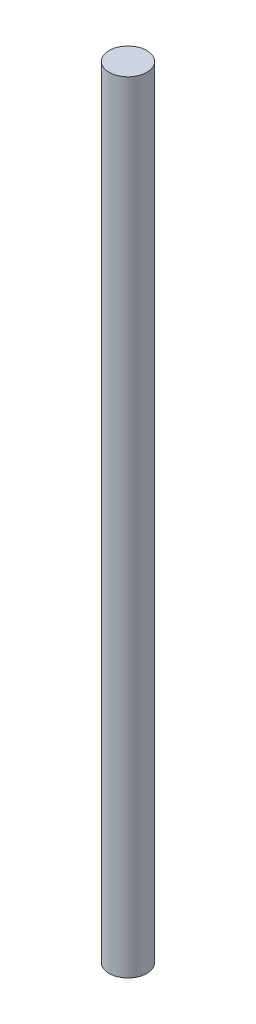
ISO-10303-21;
HEADER;
FILE_DESCRIPTION(('STEP AP214'),'2;1');
FILE_NAME('part.step','',(''),(''),'','','');
FILE_SCHEMA(('AUTOMOTIVE_DESIGN { 1 0 10303 214 1 1 1 1 }'));
ENDSEC;
DATA;
#1=APPLICATION_CONTEXT('core data for automotive mechanical design processes');
#2=APPLICATION_PROTOCOL_DEFINITION('international standard','automotive_design',2000,#1);
#3=PRODUCT_CONTEXT('',#1,'mechanical');
#4=PRODUCT('Part','Part','',(#3));
#5=PRODUCT_RELATED_PRODUCT_CATEGORY('part','',(#4));
#6=PRODUCT_DEFINITION_FORMATION('','',#4);
#7=PRODUCT_DEFINITION_CONTEXT('part definition',#1,'design');
#8=PRODUCT_DEFINITION('design','',#6,#7);
#9=PRODUCT_DEFINITION_SHAPE('','',#8);
#10=(LENGTH_UNIT() NAMED_UNIT(*) SI_UNIT(.MILLI.,.METRE.));
#11=(NAMED_UNIT(*) PLANE_ANGLE_UNIT() SI_UNIT($,.RADIAN.));
#12=(NAMED_UNIT(*) SI_UNIT($,.STERADIAN.) SOLID_ANGLE_UNIT());
#13=UNCERTAINTY_MEASURE_WITH_UNIT(LENGTH_MEASURE(1.E-05),#10,'distance_accuracy_value','');
#14=(GEOMETRIC_REPRESENTATION_CONTEXT(3) GLOBAL_UNCERTAINTY_ASSIGNED_CONTEXT((#13)) GLOBAL_UNIT_ASSIGNED_CONTEXT((#10,
#11,#12)) REPRESENTATION_CONTEXT('',''));
#15=CARTESIAN_POINT('',(0.,0.,0.));
#16=DIRECTION('',(0.,0.,1.));
#17=DIRECTION('',(1.,0.,0.));
#18=AXIS2_PLACEMENT_3D('',#15,#16,#17);
#19=CARTESIAN_POINT('',(0.,120.,0.));
#20=DIRECTION('',(0.,-1.,0.));
#21=DIRECTION('',(0.,0.,-1.));
#22=AXIS2_PLACEMENT_3D('',#19,#20,#21);
#23=CYLINDRICAL_SURFACE('',#22,2.9);
#24=CARTESIAN_POINT('',(0.,120.,0.));
#25=DIRECTION('',(0.,1.,0.));
#26=DIRECTION('',(0.,0.,1.));
#27=AXIS2_PLACEMENT_3D('',#24,#25,#26);
#28=CIRCLE('',#27,2.9);
#29=CARTESIAN_POINT('',(0.,120.,2.9));
#30=VERTEX_POINT('',#29);
#31=EDGE_CURVE('E10',#30,#30,#28,.T.);
#32=ORIENTED_EDGE('',*,*,#31,.F.);
#33=EDGE_LOOP('',(#32));
#34=FACE_BOUND('',#33,.T.);
#35=CARTESIAN_POINT('',(0.,0.,0.));
#36=DIRECTION('',(0.,1.,0.));
#37=DIRECTION('',(0.,0.,1.));
#38=AXIS2_PLACEMENT_3D('',#35,#36,#37);
#39=CIRCLE('',#38,2.9);
#40=CARTESIAN_POINT('',(0.,0.,2.9));
#41=VERTEX_POINT('',#40);
#42=EDGE_CURVE('E46',#41,#41,#39,.T.);
#43=ORIENTED_EDGE('',*,*,#42,.T.);
#44=EDGE_LOOP('',(#43));
#45=FACE_BOUND('',#44,.T.);
#46=ADVANCED_FACE('F43',(#34,#45),#23,.T.);
#47=CARTESIAN_POINT('',(0.,120.,0.));
#48=DIRECTION('',(0.,1.,0.));
#49=DIRECTION('',(0.,0.,1.));
#50=AXIS2_PLACEMENT_3D('',#47,#48,#49);
#51=PLANE('',#50);
#52=ORIENTED_EDGE('',*,*,#31,.T.);
#53=EDGE_LOOP('',(#52));
#54=FACE_BOUND('',#53,.T.);
#55=ADVANCED_FACE('F60',(#54),#51,.T.);
#56=CARTESIAN_POINT('',(0.,0.,0.));
#57=DIRECTION('',(0.,1.,0.));
#58=DIRECTION('',(0.,0.,1.));
#59=AXIS2_PLACEMENT_3D('',#56,#57,#58);
#60=PLANE('',#59);
#61=ORIENTED_EDGE('',*,*,#42,.F.);
#62=EDGE_LOOP('',(#61));
#63=FACE_BOUND('',#62,.T.);
#64=ADVANCED_FACE('F58',(#63),#60,.F.);
#65=CLOSED_SHELL('',(#46,#55,#64));
#66=MANIFOLD_SOLID_BREP('B2',#65);
#67=ADVANCED_BREP_SHAPE_REPRESENTATION('',(#18,#66),#14);
#68=SHAPE_DEFINITION_REPRESENTATION(#9,#67);
ENDSEC;
END-ISO-10303-21;
